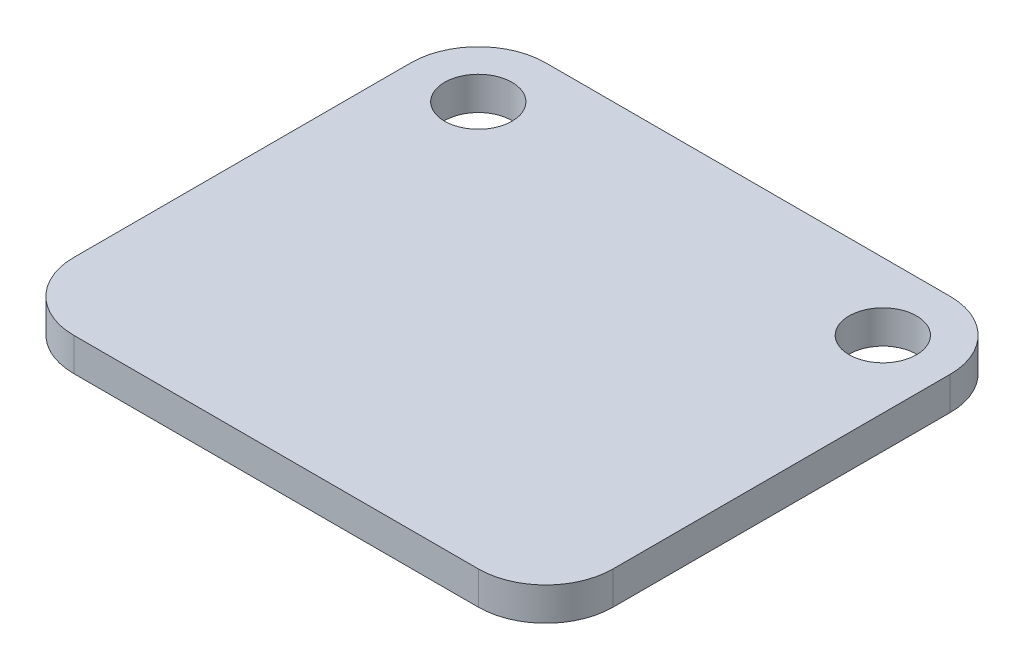
ISO-10303-21;
HEADER;
FILE_DESCRIPTION(('STEP AP214'),'2;1');
FILE_NAME('part.step','',(''),(''),'','','');
FILE_SCHEMA(('AUTOMOTIVE_DESIGN { 1 0 10303 214 1 1 1 1 }'));
ENDSEC;
DATA;
#1=APPLICATION_CONTEXT('core data for automotive mechanical design processes');
#2=APPLICATION_PROTOCOL_DEFINITION('international standard','automotive_design',2000,#1);
#3=PRODUCT_CONTEXT('',#1,'mechanical');
#4=PRODUCT('Part','Part','',(#3));
#5=PRODUCT_RELATED_PRODUCT_CATEGORY('part','',(#4));
#6=PRODUCT_DEFINITION_FORMATION('','',#4);
#7=PRODUCT_DEFINITION_CONTEXT('part definition',#1,'design');
#8=PRODUCT_DEFINITION('design','',#6,#7);
#9=PRODUCT_DEFINITION_SHAPE('','',#8);
#10=(LENGTH_UNIT() NAMED_UNIT(*) SI_UNIT(.MILLI.,.METRE.));
#11=(NAMED_UNIT(*) PLANE_ANGLE_UNIT() SI_UNIT($,.RADIAN.));
#12=(NAMED_UNIT(*) SI_UNIT($,.STERADIAN.) SOLID_ANGLE_UNIT());
#13=UNCERTAINTY_MEASURE_WITH_UNIT(LENGTH_MEASURE(1.E-05),#10,'distance_accuracy_value','');
#14=(GEOMETRIC_REPRESENTATION_CONTEXT(3) GLOBAL_UNCERTAINTY_ASSIGNED_CONTEXT((#13)) GLOBAL_UNIT_ASSIGNED_CONTEXT((#10,
#11,#12)) REPRESENTATION_CONTEXT('',''));
#15=CARTESIAN_POINT('',(0.,0.,0.));
#16=DIRECTION('',(0.,0.,1.));
#17=DIRECTION('',(1.,0.,0.));
#18=AXIS2_PLACEMENT_3D('',#15,#16,#17);
#19=CARTESIAN_POINT('',(-7.61999999999999,1.25,6.35));
#20=DIRECTION('',(0.,-1.,0.));
#21=DIRECTION('',(0.,0.,-1.));
#22=AXIS2_PLACEMENT_3D('',#19,#20,#21);
#23=CYLINDRICAL_SURFACE('',#22,2.54);
#24=CARTESIAN_POINT('',(-7.61999999999999,0.,6.35));
#25=DIRECTION('',(0.,1.,0.));
#26=DIRECTION('',(0.,0.,1.));
#27=AXIS2_PLACEMENT_3D('',#24,#25,#26);
#28=CIRCLE('',#27,2.54);
#29=CARTESIAN_POINT('',(-7.61999999999999,0.,8.88999999999999));
#30=VERTEX_POINT('',#29);
#31=CARTESIAN_POINT('',(-10.16,0.,6.35));
#32=VERTEX_POINT('',#31);
#33=EDGE_CURVE('E137',#30,#32,#28,.F.);
#34=ORIENTED_EDGE('',*,*,#33,.F.);
#35=DIRECTION('',(0.,-1.,0.));
#36=VECTOR('',#35,1.);
#37=CARTESIAN_POINT('',(-7.61999999999999,1.25,8.88999999999999));
#38=LINE('',#37,#36);
#39=CARTESIAN_POINT('',(-7.61999999999999,1.25,8.88999999999999));
#40=VERTEX_POINT('',#39);
#41=EDGE_CURVE('E11',#40,#30,#38,.T.);
#42=ORIENTED_EDGE('',*,*,#41,.F.);
#43=CARTESIAN_POINT('',(-7.61999999999999,1.25,6.35));
#44=DIRECTION('',(0.,1.,0.));
#45=DIRECTION('',(0.,0.,1.));
#46=AXIS2_PLACEMENT_3D('',#43,#44,#45);
#47=CIRCLE('',#46,2.54);
#48=CARTESIAN_POINT('',(-10.16,1.25,6.35));
#49=VERTEX_POINT('',#48);
#50=EDGE_CURVE('E163',#40,#49,#47,.F.);
#51=ORIENTED_EDGE('',*,*,#50,.T.);
#52=DIRECTION('',(0.,-1.,0.));
#53=VECTOR('',#52,1.);
#54=CARTESIAN_POINT('',(-10.16,1.25,6.35));
#55=LINE('',#54,#53);
#56=EDGE_CURVE('E51',#49,#32,#55,.T.);
#57=ORIENTED_EDGE('',*,*,#56,.T.);
#58=EDGE_LOOP('',(#34,#42,#51,#57));
#59=FACE_BOUND('',#58,.T.);
#60=ADVANCED_FACE('F35',(#59),#23,.T.);
#61=CARTESIAN_POINT('',(0.,1.25,8.88999999999999));
#62=DIRECTION('',(0.,0.,-1.));
#63=DIRECTION('',(-1.,0.,0.));
#64=AXIS2_PLACEMENT_3D('',#61,#62,#63);
#65=PLANE('',#64);
#66=DIRECTION('',(1.,0.,0.));
#67=VECTOR('',#66,1.);
#68=CARTESIAN_POINT('',(0.,0.,8.88999999999999));
#69=LINE('',#68,#67);
#70=CARTESIAN_POINT('',(7.61999999999999,0.,8.88999999999999));
#71=VERTEX_POINT('',#70);
#72=EDGE_CURVE('E139',#30,#71,#69,.T.);
#73=ORIENTED_EDGE('',*,*,#72,.T.);
#74=DIRECTION('',(0.,-1.,0.));
#75=VECTOR('',#74,1.);
#76=CARTESIAN_POINT('',(7.61999999999999,1.25,8.88999999999999));
#77=LINE('',#76,#75);
#78=CARTESIAN_POINT('',(7.61999999999999,1.25,8.88999999999999));
#79=VERTEX_POINT('',#78);
#80=EDGE_CURVE('E43',#79,#71,#77,.T.);
#81=ORIENTED_EDGE('',*,*,#80,.F.);
#82=DIRECTION('',(1.,0.,0.));
#83=VECTOR('',#82,1.);
#84=CARTESIAN_POINT('',(0.,1.25,8.88999999999999));
#85=LINE('',#84,#83);
#86=EDGE_CURVE('E189',#40,#79,#85,.T.);
#87=ORIENTED_EDGE('',*,*,#86,.F.);
#88=ORIENTED_EDGE('',*,*,#41,.T.);
#89=EDGE_LOOP('',(#73,#81,#87,#88));
#90=FACE_BOUND('',#89,.T.);
#91=ADVANCED_FACE('F179',(#90),#65,.F.);
#92=CARTESIAN_POINT('',(7.62,1.25,6.35));
#93=DIRECTION('',(0.,-1.,0.));
#94=DIRECTION('',(0.,0.,-1.));
#95=AXIS2_PLACEMENT_3D('',#92,#93,#94);
#96=CYLINDRICAL_SURFACE('',#95,2.53999999999999);
#97=CARTESIAN_POINT('',(7.62,0.,6.35));
#98=DIRECTION('',(0.,1.,0.));
#99=DIRECTION('',(0.,0.,1.));
#100=AXIS2_PLACEMENT_3D('',#97,#98,#99);
#101=CIRCLE('',#100,2.53999999999999);
#102=CARTESIAN_POINT('',(10.16,0.,6.35));
#103=VERTEX_POINT('',#102);
#104=EDGE_CURVE('E142',#103,#71,#101,.F.);
#105=ORIENTED_EDGE('',*,*,#104,.F.);
#106=DIRECTION('',(0.,-1.,0.));
#107=VECTOR('',#106,1.);
#108=CARTESIAN_POINT('',(10.16,1.25,6.35));
#109=LINE('',#108,#107);
#110=CARTESIAN_POINT('',(10.16,1.25,6.35));
#111=VERTEX_POINT('',#110);
#112=EDGE_CURVE('E169',#111,#103,#109,.T.);
#113=ORIENTED_EDGE('',*,*,#112,.F.);
#114=CARTESIAN_POINT('',(7.62,1.25,6.35));
#115=DIRECTION('',(0.,1.,0.));
#116=DIRECTION('',(0.,0.,1.));
#117=AXIS2_PLACEMENT_3D('',#114,#115,#116);
#118=CIRCLE('',#117,2.53999999999999);
#119=EDGE_CURVE('E176',#111,#79,#118,.F.);
#120=ORIENTED_EDGE('',*,*,#119,.T.);
#121=ORIENTED_EDGE('',*,*,#80,.T.);
#122=EDGE_LOOP('',(#105,#113,#120,#121));
#123=FACE_BOUND('',#122,.T.);
#124=ADVANCED_FACE('F174',(#123),#96,.T.);
#125=CARTESIAN_POINT('',(10.16,1.25,0.));
#126=DIRECTION('',(-1.,0.,0.));
#127=DIRECTION('',(0.,0.,1.));
#128=AXIS2_PLACEMENT_3D('',#125,#126,#127);
#129=PLANE('',#128);
#130=DIRECTION('',(0.,0.,-1.));
#131=VECTOR('',#130,1.);
#132=CARTESIAN_POINT('',(10.16,0.,0.));
#133=LINE('',#132,#131);
#134=CARTESIAN_POINT('',(10.16,0.,-6.35));
#135=VERTEX_POINT('',#134);
#136=EDGE_CURVE('E145',#103,#135,#133,.T.);
#137=ORIENTED_EDGE('',*,*,#136,.T.);
#138=DIRECTION('',(0.,-1.,0.));
#139=VECTOR('',#138,1.);
#140=CARTESIAN_POINT('',(10.16,1.25,-6.35));
#141=LINE('',#140,#139);
#142=CARTESIAN_POINT('',(10.16,1.25,-6.35));
#143=VERTEX_POINT('',#142);
#144=EDGE_CURVE('E167',#143,#135,#141,.T.);
#145=ORIENTED_EDGE('',*,*,#144,.F.);
#146=DIRECTION('',(0.,0.,-1.));
#147=VECTOR('',#146,1.);
#148=CARTESIAN_POINT('',(10.16,1.25,0.));
#149=LINE('',#148,#147);
#150=EDGE_CURVE('E126',#111,#143,#149,.T.);
#151=ORIENTED_EDGE('',*,*,#150,.F.);
#152=ORIENTED_EDGE('',*,*,#112,.T.);
#153=EDGE_LOOP('',(#137,#145,#151,#152));
#154=FACE_BOUND('',#153,.T.);
#155=ADVANCED_FACE('F187',(#154),#129,.F.);
#156=CARTESIAN_POINT('',(7.62,1.25,-6.35));
#157=DIRECTION('',(0.,-1.,0.));
#158=DIRECTION('',(0.,0.,-1.));
#159=AXIS2_PLACEMENT_3D('',#156,#157,#158);
#160=CYLINDRICAL_SURFACE('',#159,2.54);
#161=CARTESIAN_POINT('',(7.62,0.,-6.35));
#162=DIRECTION('',(0.,1.,0.));
#163=DIRECTION('',(0.,0.,1.));
#164=AXIS2_PLACEMENT_3D('',#161,#162,#163);
#165=CIRCLE('',#164,2.54);
#166=CARTESIAN_POINT('',(7.62,0.,-8.89));
#167=VERTEX_POINT('',#166);
#168=EDGE_CURVE('E148',#167,#135,#165,.F.);
#169=ORIENTED_EDGE('',*,*,#168,.F.);
#170=DIRECTION('',(0.,-1.,0.));
#171=VECTOR('',#170,1.);
#172=CARTESIAN_POINT('',(7.62,1.25,-8.89));
#173=LINE('',#172,#171);
#174=CARTESIAN_POINT('',(7.62,1.25,-8.89));
#175=VERTEX_POINT('',#174);
#176=EDGE_CURVE('E111',#175,#167,#173,.T.);
#177=ORIENTED_EDGE('',*,*,#176,.F.);
#178=CARTESIAN_POINT('',(7.62,1.25,-6.35));
#179=DIRECTION('',(0.,1.,0.));
#180=DIRECTION('',(0.,0.,1.));
#181=AXIS2_PLACEMENT_3D('',#178,#179,#180);
#182=CIRCLE('',#181,2.54);
#183=EDGE_CURVE('E124',#175,#143,#182,.F.);
#184=ORIENTED_EDGE('',*,*,#183,.T.);
#185=ORIENTED_EDGE('',*,*,#144,.T.);
#186=EDGE_LOOP('',(#169,#177,#184,#185));
#187=FACE_BOUND('',#186,.T.);
#188=ADVANCED_FACE('F218',(#187),#160,.T.);
#189=CARTESIAN_POINT('',(0.,1.25,-8.89));
#190=DIRECTION('',(0.,0.,-1.));
#191=DIRECTION('',(-1.,0.,0.));
#192=AXIS2_PLACEMENT_3D('',#189,#190,#191);
#193=PLANE('',#192);
#194=DIRECTION('',(1.,0.,0.));
#195=VECTOR('',#194,1.);
#196=CARTESIAN_POINT('',(0.,0.,-8.89));
#197=LINE('',#196,#195);
#198=CARTESIAN_POINT('',(-7.61999999999999,0.,-8.89));
#199=VERTEX_POINT('',#198);
#200=EDGE_CURVE('E108',#199,#167,#197,.T.);
#201=ORIENTED_EDGE('',*,*,#200,.F.);
#202=DIRECTION('',(0.,-1.,0.));
#203=VECTOR('',#202,1.);
#204=CARTESIAN_POINT('',(-7.61999999999999,1.25,-8.89));
#205=LINE('',#204,#203);
#206=CARTESIAN_POINT('',(-7.61999999999999,1.25,-8.89));
#207=VERTEX_POINT('',#206);
#208=EDGE_CURVE('E102',#207,#199,#205,.T.);
#209=ORIENTED_EDGE('',*,*,#208,.F.);
#210=DIRECTION('',(1.,0.,0.));
#211=VECTOR('',#210,1.);
#212=CARTESIAN_POINT('',(0.,1.25,-8.89));
#213=LINE('',#212,#211);
#214=EDGE_CURVE('E106',#207,#175,#213,.T.);
#215=ORIENTED_EDGE('',*,*,#214,.T.);
#216=ORIENTED_EDGE('',*,*,#176,.T.);
#217=EDGE_LOOP('',(#201,#209,#215,#216));
#218=FACE_BOUND('',#217,.T.);
#219=ADVANCED_FACE('F104',(#218),#193,.T.);
#220=CARTESIAN_POINT('',(-7.62,1.25,-6.35));
#221=DIRECTION('',(0.,-1.,0.));
#222=DIRECTION('',(0.,0.,-1.));
#223=AXIS2_PLACEMENT_3D('',#220,#221,#222);
#224=CYLINDRICAL_SURFACE('',#223,2.54);
#225=CARTESIAN_POINT('',(-7.62,0.,-6.35));
#226=DIRECTION('',(0.,1.,0.));
#227=DIRECTION('',(0.,0.,1.));
#228=AXIS2_PLACEMENT_3D('',#225,#226,#227);
#229=CIRCLE('',#228,2.54);
#230=CARTESIAN_POINT('',(-10.16,0.,-6.35));
#231=VERTEX_POINT('',#230);
#232=EDGE_CURVE('E152',#199,#231,#229,.T.);
#233=ORIENTED_EDGE('',*,*,#232,.T.);
#234=DIRECTION('',(0.,-1.,0.));
#235=VECTOR('',#234,1.);
#236=CARTESIAN_POINT('',(-10.16,1.25,-6.35));
#237=LINE('',#236,#235);
#238=CARTESIAN_POINT('',(-10.16,1.25,-6.35));
#239=VERTEX_POINT('',#238);
#240=EDGE_CURVE('E77',#239,#231,#237,.T.);
#241=ORIENTED_EDGE('',*,*,#240,.F.);
#242=CARTESIAN_POINT('',(-7.62,1.25,-6.35));
#243=DIRECTION('',(0.,1.,0.));
#244=DIRECTION('',(0.,0.,1.));
#245=AXIS2_PLACEMENT_3D('',#242,#243,#244);
#246=CIRCLE('',#245,2.54);
#247=EDGE_CURVE('E113',#207,#239,#246,.T.);
#248=ORIENTED_EDGE('',*,*,#247,.F.);
#249=ORIENTED_EDGE('',*,*,#208,.T.);
#250=EDGE_LOOP('',(#233,#241,#248,#249));
#251=FACE_BOUND('',#250,.T.);
#252=ADVANCED_FACE('F114',(#251),#224,.T.);
#253=CARTESIAN_POINT('',(7.62,1.25,-6.35));
#254=DIRECTION('',(0.,-1.,0.));
#255=DIRECTION('',(0.,0.,-1.));
#256=AXIS2_PLACEMENT_3D('',#253,#254,#255);
#257=CYLINDRICAL_SURFACE('',#256,1.27);
#258=CARTESIAN_POINT('',(7.62,1.25,-6.35));
#259=DIRECTION('',(0.,1.,0.));
#260=DIRECTION('',(0.,0.,1.));
#261=AXIS2_PLACEMENT_3D('',#258,#259,#260);
#262=CIRCLE('',#261,1.27);
#263=CARTESIAN_POINT('',(7.62,1.25,-5.08));
#264=VERTEX_POINT('',#263);
#265=EDGE_CURVE('E131',#264,#264,#262,.T.);
#266=ORIENTED_EDGE('',*,*,#265,.T.);
#267=EDGE_LOOP('',(#266));
#268=FACE_BOUND('',#267,.T.);
#269=CARTESIAN_POINT('',(7.62,0.,-6.35));
#270=DIRECTION('',(0.,1.,0.));
#271=DIRECTION('',(0.,0.,1.));
#272=AXIS2_PLACEMENT_3D('',#269,#270,#271);
#273=CIRCLE('',#272,1.27);
#274=CARTESIAN_POINT('',(7.62,0.,-5.08));
#275=VERTEX_POINT('',#274);
#276=EDGE_CURVE('E157',#275,#275,#273,.T.);
#277=ORIENTED_EDGE('',*,*,#276,.F.);
#278=EDGE_LOOP('',(#277));
#279=FACE_BOUND('',#278,.T.);
#280=ADVANCED_FACE('F196',(#268,#279),#257,.F.);
#281=CARTESIAN_POINT('',(-10.16,1.25,0.));
#282=DIRECTION('',(-1.,0.,0.));
#283=DIRECTION('',(0.,0.,1.));
#284=AXIS2_PLACEMENT_3D('',#281,#282,#283);
#285=PLANE('',#284);
#286=DIRECTION('',(0.,0.,-1.));
#287=VECTOR('',#286,1.);
#288=CARTESIAN_POINT('',(-10.16,0.,0.));
#289=LINE('',#288,#287);
#290=EDGE_CURVE('E154',#32,#231,#289,.T.);
#291=ORIENTED_EDGE('',*,*,#290,.F.);
#292=ORIENTED_EDGE('',*,*,#56,.F.);
#293=DIRECTION('',(0.,0.,-1.));
#294=VECTOR('',#293,1.);
#295=CARTESIAN_POINT('',(-10.16,1.25,0.));
#296=LINE('',#295,#294);
#297=EDGE_CURVE('E117',#49,#239,#296,.T.);
#298=ORIENTED_EDGE('',*,*,#297,.T.);
#299=ORIENTED_EDGE('',*,*,#240,.T.);
#300=EDGE_LOOP('',(#291,#292,#298,#299));
#301=FACE_BOUND('',#300,.T.);
#302=ADVANCED_FACE('F193',(#301),#285,.T.);
#303=CARTESIAN_POINT('',(-7.62,1.25,-6.35));
#304=DIRECTION('',(0.,-1.,0.));
#305=DIRECTION('',(0.,0.,-1.));
#306=AXIS2_PLACEMENT_3D('',#303,#304,#305);
#307=CYLINDRICAL_SURFACE('',#306,1.27);
#308=CARTESIAN_POINT('',(-7.62,1.25,-6.35));
#309=DIRECTION('',(0.,1.,0.));
#310=DIRECTION('',(0.,0.,1.));
#311=AXIS2_PLACEMENT_3D('',#308,#309,#310);
#312=CIRCLE('',#311,1.27);
#313=CARTESIAN_POINT('',(-7.62,1.25,-5.08));
#314=VERTEX_POINT('',#313);
#315=EDGE_CURVE('E134',#314,#314,#312,.T.);
#316=ORIENTED_EDGE('',*,*,#315,.T.);
#317=EDGE_LOOP('',(#316));
#318=FACE_BOUND('',#317,.T.);
#319=CARTESIAN_POINT('',(-7.62,0.,-6.35));
#320=DIRECTION('',(0.,1.,0.));
#321=DIRECTION('',(0.,0.,1.));
#322=AXIS2_PLACEMENT_3D('',#319,#320,#321);
#323=CIRCLE('',#322,1.27);
#324=CARTESIAN_POINT('',(-7.62,0.,-5.08));
#325=VERTEX_POINT('',#324);
#326=EDGE_CURVE('E160',#325,#325,#323,.T.);
#327=ORIENTED_EDGE('',*,*,#326,.F.);
#328=EDGE_LOOP('',(#327));
#329=FACE_BOUND('',#328,.T.);
#330=ADVANCED_FACE('F195',(#318,#329),#307,.F.);
#331=CARTESIAN_POINT('',(0.,1.25,0.));
#332=DIRECTION('',(0.,1.,0.));
#333=DIRECTION('',(0.,0.,1.));
#334=AXIS2_PLACEMENT_3D('',#331,#332,#333);
#335=PLANE('',#334);
#336=ORIENTED_EDGE('',*,*,#50,.F.);
#337=ORIENTED_EDGE('',*,*,#86,.T.);
#338=ORIENTED_EDGE('',*,*,#119,.F.);
#339=ORIENTED_EDGE('',*,*,#150,.T.);
#340=ORIENTED_EDGE('',*,*,#183,.F.);
#341=ORIENTED_EDGE('',*,*,#214,.F.);
#342=ORIENTED_EDGE('',*,*,#247,.T.);
#343=ORIENTED_EDGE('',*,*,#297,.F.);
#344=EDGE_LOOP('',(#336,#337,#338,#339,#340,#341,#342,#343));
#345=FACE_BOUND('',#344,.T.);
#346=ORIENTED_EDGE('',*,*,#265,.F.);
#347=EDGE_LOOP('',(#346));
#348=FACE_BOUND('',#347,.T.);
#349=ORIENTED_EDGE('',*,*,#315,.F.);
#350=EDGE_LOOP('',(#349));
#351=FACE_BOUND('',#350,.T.);
#352=ADVANCED_FACE('F121',(#345,#348,#351),#335,.T.);
#353=CARTESIAN_POINT('',(0.,0.,0.));
#354=DIRECTION('',(0.,1.,0.));
#355=DIRECTION('',(0.,0.,1.));
#356=AXIS2_PLACEMENT_3D('',#353,#354,#355);
#357=PLANE('',#356);
#358=ORIENTED_EDGE('',*,*,#33,.T.);
#359=ORIENTED_EDGE('',*,*,#290,.T.);
#360=ORIENTED_EDGE('',*,*,#232,.F.);
#361=ORIENTED_EDGE('',*,*,#200,.T.);
#362=ORIENTED_EDGE('',*,*,#168,.T.);
#363=ORIENTED_EDGE('',*,*,#136,.F.);
#364=ORIENTED_EDGE('',*,*,#104,.T.);
#365=ORIENTED_EDGE('',*,*,#72,.F.);
#366=EDGE_LOOP('',(#358,#359,#360,#361,#362,#363,#364,#365));
#367=FACE_BOUND('',#366,.T.);
#368=ORIENTED_EDGE('',*,*,#276,.T.);
#369=EDGE_LOOP('',(#368));
#370=FACE_BOUND('',#369,.T.);
#371=ORIENTED_EDGE('',*,*,#326,.T.);
#372=EDGE_LOOP('',(#371));
#373=FACE_BOUND('',#372,.T.);
#374=ADVANCED_FACE('F182',(#367,#370,#373),#357,.F.);
#375=CLOSED_SHELL('',(#60,#91,#124,#155,#188,#219,#252,#280,#302,#330,#352,#374));
#376=MANIFOLD_SOLID_BREP('B2',#375);
#377=ADVANCED_BREP_SHAPE_REPRESENTATION('',(#18,#376),#14);
#378=SHAPE_DEFINITION_REPRESENTATION(#9,#377);
ENDSEC;
END-ISO-10303-21;
